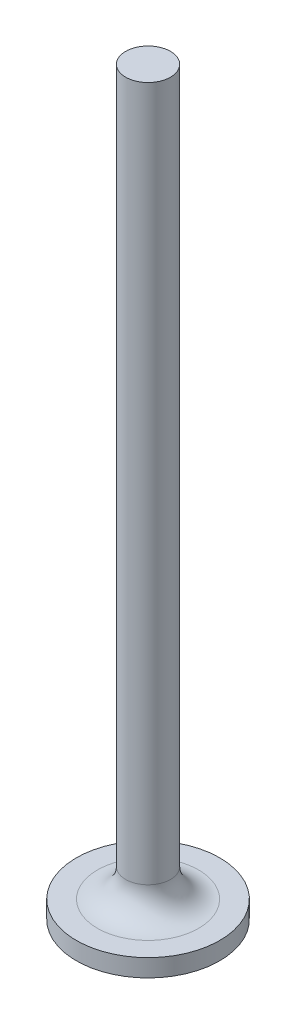
ISO-10303-21;
HEADER;
FILE_DESCRIPTION(('STEP AP214'),'2;1');
FILE_NAME('part.step','',(''),(''),'','','');
FILE_SCHEMA(('AUTOMOTIVE_DESIGN { 1 0 10303 214 1 1 1 1 }'));
ENDSEC;
DATA;
#1=APPLICATION_CONTEXT('core data for automotive mechanical design processes');
#2=APPLICATION_PROTOCOL_DEFINITION('international standard','automotive_design',2000,#1);
#3=PRODUCT_CONTEXT('',#1,'mechanical');
#4=PRODUCT('Part','Part','',(#3));
#5=PRODUCT_RELATED_PRODUCT_CATEGORY('part','',(#4));
#6=PRODUCT_DEFINITION_FORMATION('','',#4);
#7=PRODUCT_DEFINITION_CONTEXT('part definition',#1,'design');
#8=PRODUCT_DEFINITION('design','',#6,#7);
#9=PRODUCT_DEFINITION_SHAPE('','',#8);
#10=(LENGTH_UNIT() NAMED_UNIT(*) SI_UNIT(.MILLI.,.METRE.));
#11=(NAMED_UNIT(*) PLANE_ANGLE_UNIT() SI_UNIT($,.RADIAN.));
#12=(NAMED_UNIT(*) SI_UNIT($,.STERADIAN.) SOLID_ANGLE_UNIT());
#13=UNCERTAINTY_MEASURE_WITH_UNIT(LENGTH_MEASURE(1.E-05),#10,'distance_accuracy_value','');
#14=(GEOMETRIC_REPRESENTATION_CONTEXT(3) GLOBAL_UNCERTAINTY_ASSIGNED_CONTEXT((#13)) GLOBAL_UNIT_ASSIGNED_CONTEXT((#10,
#11,#12)) REPRESENTATION_CONTEXT('',''));
#15=CARTESIAN_POINT('',(0.,0.,0.));
#16=DIRECTION('',(0.,0.,1.));
#17=DIRECTION('',(1.,0.,0.));
#18=AXIS2_PLACEMENT_3D('',#15,#16,#17);
#19=CARTESIAN_POINT('',(0.,0.,0.));
#20=DIRECTION('',(0.,-1.,0.));
#21=DIRECTION('',(0.,0.,-1.));
#22=AXIS2_PLACEMENT_3D('',#19,#20,#21);
#23=PLANE('',#22);
#24=CARTESIAN_POINT('',(0.,0.,0.));
#25=DIRECTION('',(0.,-1.,0.));
#26=DIRECTION('',(0.,0.,-1.));
#27=AXIS2_PLACEMENT_3D('',#24,#25,#26);
#28=CIRCLE('',#27,10.16);
#29=CARTESIAN_POINT('',(0.,0.,-10.16));
#30=VERTEX_POINT('',#29);
#31=EDGE_CURVE('E52',#30,#30,#28,.T.);
#32=ORIENTED_EDGE('',*,*,#31,.T.);
#33=EDGE_LOOP('',(#32));
#34=FACE_BOUND('',#33,.T.);
#35=ADVANCED_FACE('F41',(#34),#23,.T.);
#36=CARTESIAN_POINT('',(0.,-31.8317037555853,0.));
#37=DIRECTION('',(0.,-1.,0.));
#38=DIRECTION('',(0.,0.,-1.));
#39=AXIS2_PLACEMENT_3D('',#36,#37,#38);
#40=CYLINDRICAL_SURFACE('',#39,10.16);
#41=CARTESIAN_POINT('',(0.,2.5,0.));
#42=DIRECTION('',(0.,-1.,0.));
#43=DIRECTION('',(0.,0.,-1.));
#44=AXIS2_PLACEMENT_3D('',#41,#42,#43);
#45=CIRCLE('',#44,10.16);
#46=CARTESIAN_POINT('',(0.,2.5,-10.16));
#47=VERTEX_POINT('',#46);
#48=EDGE_CURVE('E56',#47,#47,#45,.T.);
#49=ORIENTED_EDGE('',*,*,#48,.T.);
#50=EDGE_LOOP('',(#49));
#51=FACE_BOUND('',#50,.T.);
#52=ORIENTED_EDGE('',*,*,#31,.F.);
#53=EDGE_LOOP('',(#52));
#54=FACE_BOUND('',#53,.T.);
#55=ADVANCED_FACE('F78',(#51,#54),#40,.T.);
#56=CARTESIAN_POINT('',(10.16,2.5,0.));
#57=DIRECTION('',(0.,1.,0.));
#58=DIRECTION('',(0.,0.,1.));
#59=AXIS2_PLACEMENT_3D('',#56,#57,#58);
#60=PLANE('',#59);
#61=CARTESIAN_POINT('',(0.,2.5,0.));
#62=DIRECTION('',(0.,1.,0.));
#63=DIRECTION('',(0.,0.,1.));
#64=AXIS2_PLACEMENT_3D('',#61,#62,#63);
#65=CIRCLE('',#64,7.175);
#66=CARTESIAN_POINT('',(0.,2.5,7.175));
#67=VERTEX_POINT('',#66);
#68=EDGE_CURVE('E48',#67,#67,#65,.F.);
#69=ORIENTED_EDGE('',*,*,#68,.T.);
#70=EDGE_LOOP('',(#69));
#71=FACE_BOUND('',#70,.T.);
#72=ORIENTED_EDGE('',*,*,#48,.F.);
#73=EDGE_LOOP('',(#72));
#74=FACE_BOUND('',#73,.T.);
#75=ADVANCED_FACE('F75',(#71,#74),#60,.T.);
#76=CARTESIAN_POINT('',(0.,-31.8317037555853,0.));
#77=DIRECTION('',(0.,-1.,0.));
#78=DIRECTION('',(0.,0.,-1.));
#79=AXIS2_PLACEMENT_3D('',#76,#77,#78);
#80=CYLINDRICAL_SURFACE('',#79,3.175);
#81=CARTESIAN_POINT('',(0.,6.5,0.));
#82=DIRECTION('',(0.,1.,0.));
#83=DIRECTION('',(0.,0.,1.));
#84=AXIS2_PLACEMENT_3D('',#81,#82,#83);
#85=CIRCLE('',#84,3.175);
#86=CARTESIAN_POINT('',(0.,6.5,3.175));
#87=VERTEX_POINT('',#86);
#88=EDGE_CURVE('E10',#87,#87,#85,.T.);
#89=ORIENTED_EDGE('',*,*,#88,.T.);
#90=EDGE_LOOP('',(#89));
#91=FACE_BOUND('',#90,.T.);
#92=CARTESIAN_POINT('',(0.,105.,0.));
#93=DIRECTION('',(0.,-1.,0.));
#94=DIRECTION('',(0.,0.,-1.));
#95=AXIS2_PLACEMENT_3D('',#92,#93,#94);
#96=CIRCLE('',#95,3.175);
#97=CARTESIAN_POINT('',(0.,105.,-3.175));
#98=VERTEX_POINT('',#97);
#99=EDGE_CURVE('E61',#98,#98,#96,.T.);
#100=ORIENTED_EDGE('',*,*,#99,.T.);
#101=EDGE_LOOP('',(#100));
#102=FACE_BOUND('',#101,.T.);
#103=ADVANCED_FACE('F65',(#91,#102),#80,.T.);
#104=CARTESIAN_POINT('',(3.175,105.,0.));
#105=DIRECTION('',(0.,1.,0.));
#106=DIRECTION('',(0.,0.,1.));
#107=AXIS2_PLACEMENT_3D('',#104,#105,#106);
#108=PLANE('',#107);
#109=ORIENTED_EDGE('',*,*,#99,.F.);
#110=EDGE_LOOP('',(#109));
#111=FACE_BOUND('',#110,.T.);
#112=ADVANCED_FACE('F67',(#111),#108,.T.);
#113=CARTESIAN_POINT('',(0.,6.5,0.));
#114=DIRECTION('',(0.,1.,0.));
#115=DIRECTION('',(0.,0.,1.));
#116=AXIS2_PLACEMENT_3D('',#113,#114,#115);
#117=TOROIDAL_SURFACE('',#116,7.175,4.);
#118=ORIENTED_EDGE('',*,*,#88,.F.);
#119=EDGE_LOOP('',(#118));
#120=FACE_BOUND('',#119,.T.);
#121=ORIENTED_EDGE('',*,*,#68,.F.);
#122=EDGE_LOOP('',(#121));
#123=FACE_BOUND('',#122,.T.);
#124=ADVANCED_FACE('F43',(#120,#123),#117,.F.);
#125=CLOSED_SHELL('',(#35,#55,#75,#103,#112,#124));
#126=MANIFOLD_SOLID_BREP('B2',#125);
#127=ADVANCED_BREP_SHAPE_REPRESENTATION('',(#18,#126),#14);
#128=SHAPE_DEFINITION_REPRESENTATION(#9,#127);
ENDSEC;
END-ISO-10303-21;
